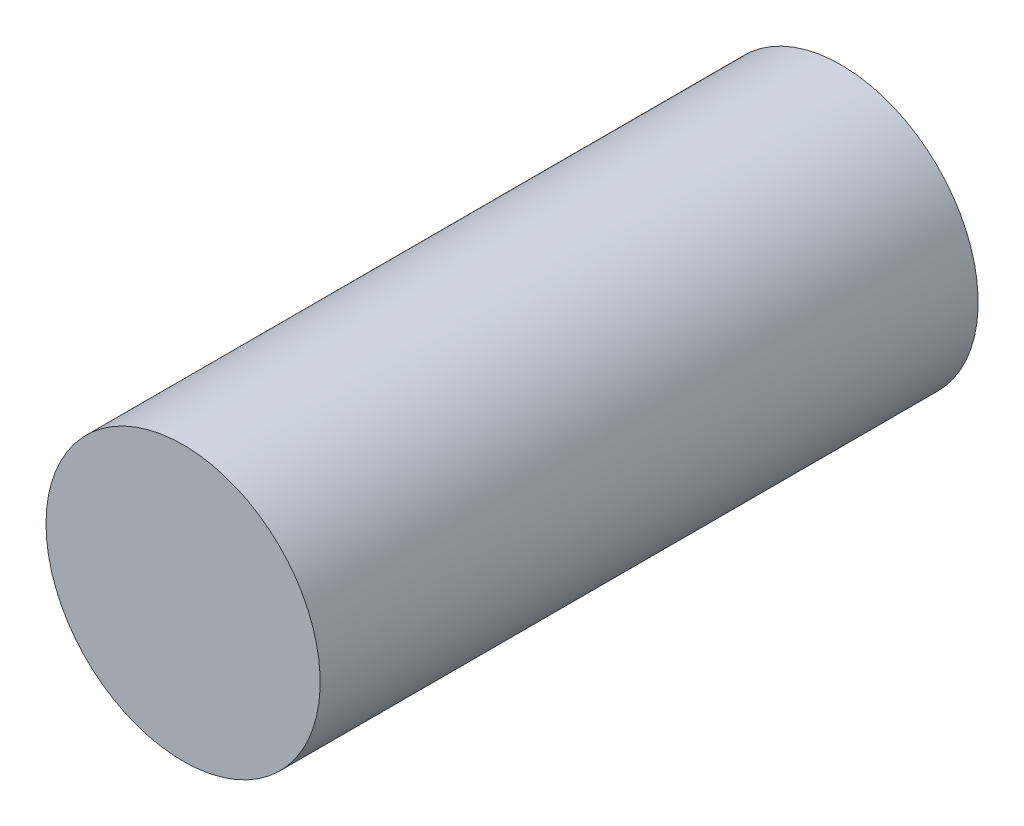
ISO-10303-21;
HEADER;
FILE_DESCRIPTION(('STEP AP214'),'2;1');
FILE_NAME('part.step','',(''),(''),'','','');
FILE_SCHEMA(('AUTOMOTIVE_DESIGN { 1 0 10303 214 1 1 1 1 }'));
ENDSEC;
DATA;
#1=APPLICATION_CONTEXT('core data for automotive mechanical design processes');
#2=APPLICATION_PROTOCOL_DEFINITION('international standard','automotive_design',2000,#1);
#3=PRODUCT_CONTEXT('',#1,'mechanical');
#4=PRODUCT('Part','Part','',(#3));
#5=PRODUCT_RELATED_PRODUCT_CATEGORY('part','',(#4));
#6=PRODUCT_DEFINITION_FORMATION('','',#4);
#7=PRODUCT_DEFINITION_CONTEXT('part definition',#1,'design');
#8=PRODUCT_DEFINITION('design','',#6,#7);
#9=PRODUCT_DEFINITION_SHAPE('','',#8);
#10=(LENGTH_UNIT() NAMED_UNIT(*) SI_UNIT(.MILLI.,.METRE.));
#11=(NAMED_UNIT(*) PLANE_ANGLE_UNIT() SI_UNIT($,.RADIAN.));
#12=(NAMED_UNIT(*) SI_UNIT($,.STERADIAN.) SOLID_ANGLE_UNIT());
#13=UNCERTAINTY_MEASURE_WITH_UNIT(LENGTH_MEASURE(1.E-05),#10,'distance_accuracy_value','');
#14=(GEOMETRIC_REPRESENTATION_CONTEXT(3) GLOBAL_UNCERTAINTY_ASSIGNED_CONTEXT((#13)) GLOBAL_UNIT_ASSIGNED_CONTEXT((#10,
#11,#12)) REPRESENTATION_CONTEXT('',''));
#15=CARTESIAN_POINT('',(0.,0.,0.));
#16=DIRECTION('',(0.,0.,1.));
#17=DIRECTION('',(1.,0.,0.));
#18=AXIS2_PLACEMENT_3D('',#15,#16,#17);
#19=CARTESIAN_POINT('',(0.,0.,38.1));
#20=DIRECTION('',(0.,0.,-1.));
#21=DIRECTION('',(-1.,0.,0.));
#22=AXIS2_PLACEMENT_3D('',#19,#20,#21);
#23=CYLINDRICAL_SURFACE('',#22,7.9375);
#24=CARTESIAN_POINT('',(0.,0.,38.1));
#25=DIRECTION('',(0.,0.,1.));
#26=DIRECTION('',(1.,0.,0.));
#27=AXIS2_PLACEMENT_3D('',#24,#25,#26);
#28=CIRCLE('',#27,7.9375);
#29=CARTESIAN_POINT('',(-7.9375,0.,38.1));
#30=VERTEX_POINT('',#29);
#31=EDGE_CURVE('E10',#30,#30,#28,.T.);
#32=CARTESIAN_POINT('',(0.,0.,0.));
#33=DIRECTION('',(0.,0.,1.));
#34=DIRECTION('',(1.,0.,0.));
#35=AXIS2_PLACEMENT_3D('',#32,#33,#34);
#36=CIRCLE('',#35,7.9375);
#37=CARTESIAN_POINT('',(-7.9375,0.,0.));
#38=VERTEX_POINT('',#37);
#39=EDGE_CURVE('E42',#38,#38,#36,.T.);
#40=CARTESIAN_POINT('',(-7.9375,0.,38.1));
#41=CARTESIAN_POINT('',(-7.9375,0.,37.703125));
#42=CARTESIAN_POINT('',(-7.9375,0.,37.30625));
#43=CARTESIAN_POINT('',(-7.9375,0.,36.5125));
#44=CARTESIAN_POINT('',(-7.9375,0.,36.115625));
#45=CARTESIAN_POINT('',(-7.9375,0.,35.321875));
#46=CARTESIAN_POINT('',(-7.9375,0.,34.925));
#47=CARTESIAN_POINT('',(-7.9375,0.,34.13125));
#48=CARTESIAN_POINT('',(-7.9375,0.,33.734375));
#49=CARTESIAN_POINT('',(-7.9375,0.,32.940625));
#50=CARTESIAN_POINT('',(-7.9375,0.,32.54375));
#51=CARTESIAN_POINT('',(-7.9375,0.,31.75));
#52=CARTESIAN_POINT('',(-7.9375,0.,31.353125));
#53=CARTESIAN_POINT('',(-7.9375,0.,30.559375));
#54=CARTESIAN_POINT('',(-7.9375,0.,30.1625));
#55=CARTESIAN_POINT('',(-7.9375,0.,29.36875));
#56=CARTESIAN_POINT('',(-7.9375,0.,28.971875));
#57=CARTESIAN_POINT('',(-7.9375,0.,28.178125));
#58=CARTESIAN_POINT('',(-7.9375,0.,27.78125));
#59=CARTESIAN_POINT('',(-7.9375,0.,26.9875));
#60=CARTESIAN_POINT('',(-7.9375,0.,26.590625));
#61=CARTESIAN_POINT('',(-7.9375,0.,25.796875));
#62=CARTESIAN_POINT('',(-7.9375,0.,25.4));
#63=CARTESIAN_POINT('',(-7.9375,0.,24.60625));
#64=CARTESIAN_POINT('',(-7.9375,0.,24.209375));
#65=CARTESIAN_POINT('',(-7.9375,0.,23.415625));
#66=CARTESIAN_POINT('',(-7.9375,0.,23.01875));
#67=CARTESIAN_POINT('',(-7.9375,0.,22.225));
#68=CARTESIAN_POINT('',(-7.9375,0.,21.828125));
#69=CARTESIAN_POINT('',(-7.9375,0.,21.034375));
#70=CARTESIAN_POINT('',(-7.9375,0.,20.6375));
#71=CARTESIAN_POINT('',(-7.9375,0.,19.84375));
#72=CARTESIAN_POINT('',(-7.9375,0.,19.446875));
#73=CARTESIAN_POINT('',(-7.9375,0.,18.653125));
#74=CARTESIAN_POINT('',(-7.9375,0.,18.25625));
#75=CARTESIAN_POINT('',(-7.9375,0.,17.4625));
#76=CARTESIAN_POINT('',(-7.9375,0.,17.065625));
#77=CARTESIAN_POINT('',(-7.9375,0.,16.271875));
#78=CARTESIAN_POINT('',(-7.9375,0.,15.875));
#79=CARTESIAN_POINT('',(-7.9375,0.,15.08125));
#80=CARTESIAN_POINT('',(-7.9375,0.,14.684375));
#81=CARTESIAN_POINT('',(-7.9375,0.,13.890625));
#82=CARTESIAN_POINT('',(-7.9375,0.,13.49375));
#83=CARTESIAN_POINT('',(-7.9375,0.,12.7));
#84=CARTESIAN_POINT('',(-7.9375,0.,12.303125));
#85=CARTESIAN_POINT('',(-7.9375,0.,11.509375));
#86=CARTESIAN_POINT('',(-7.9375,0.,11.1125));
#87=CARTESIAN_POINT('',(-7.9375,0.,10.31875));
#88=CARTESIAN_POINT('',(-7.9375,0.,9.92187499999999));
#89=CARTESIAN_POINT('',(-7.9375,0.,9.128125));
#90=CARTESIAN_POINT('',(-7.9375,0.,8.73124999999999));
#91=CARTESIAN_POINT('',(-7.9375,0.,7.93749999999999));
#92=CARTESIAN_POINT('',(-7.9375,0.,7.54062499999999));
#93=CARTESIAN_POINT('',(-7.9375,0.,6.746875));
#94=CARTESIAN_POINT('',(-7.9375,0.,6.35));
#95=CARTESIAN_POINT('',(-7.9375,0.,5.55625));
#96=CARTESIAN_POINT('',(-7.9375,0.,5.159375));
#97=CARTESIAN_POINT('',(-7.9375,0.,4.365625));
#98=CARTESIAN_POINT('',(-7.9375,0.,3.96875));
#99=CARTESIAN_POINT('',(-7.9375,0.,3.175));
#100=CARTESIAN_POINT('',(-7.9375,0.,2.778125));
#101=CARTESIAN_POINT('',(-7.9375,0.,1.984375));
#102=CARTESIAN_POINT('',(-7.9375,0.,1.5875));
#103=CARTESIAN_POINT('',(-7.9375,0.,0.79375));
#104=CARTESIAN_POINT('',(-7.9375,0.,0.396875));
#105=CARTESIAN_POINT('',(-7.9375,0.,0.));
#106=B_SPLINE_CURVE_WITH_KNOTS('',3,(#40,#41,#42,#43,#44,#45,#46,#47,#48,#49,#50,#51,#52,#53,
#54,#55,#56,#57,#58,#59,#60,#61,#62,#63,#64,#65,#66,#67,#68,#69,#70,#71,#72,#73,#74,#75,#76,#77,
#78,#79,#80,#81,#82,#83,#84,#85,#86,#87,#88,#89,#90,#91,#92,#93,#94,#95,#96,#97,#98,#99,#100,
#101,#102,#103,#104,#105),.UNSPECIFIED.,.F.,.F.,(4,2,2,2,2,2,2,2,2,2,2,2,2,2,2,2,2,2,2,2,2,2,2,
2,2,2,2,2,2,2,2,2,4),(0.,1.190625,2.38125,3.571875,4.7625,5.953125,7.14375,8.334375,
9.52500000000001,10.715625,11.90625,13.096875,14.2875,15.478125,16.66875,17.859375,19.05,
20.240625,21.43125,22.621875,23.8125,25.003125,26.19375,27.384375,28.575,29.765625,30.95625,
32.146875,33.3375,34.528125,35.71875,36.909375,38.1),.UNSPECIFIED.);
#107=EDGE_CURVE('BSEAM39',#30,#38,#106,.T.);
#108=ORIENTED_EDGE('',*,*,#31,.F.);
#109=ORIENTED_EDGE('',*,*,#39,.T.);
#110=ORIENTED_EDGE('',*,*,#107,.T.);
#111=ORIENTED_EDGE('',*,*,#107,.F.);
#112=EDGE_LOOP('',(#108,#110,#109,#111));
#113=FACE_BOUND('',#112,.T.);
#114=ADVANCED_FACE('F39',(#113),#23,.T.);
#115=CARTESIAN_POINT('',(0.,0.,38.1));
#116=DIRECTION('',(0.,0.,1.));
#117=DIRECTION('',(1.,0.,0.));
#118=AXIS2_PLACEMENT_3D('',#115,#116,#117);
#119=PLANE('',#118);
#120=ORIENTED_EDGE('',*,*,#31,.T.);
#121=EDGE_LOOP('',(#120));
#122=FACE_BOUND('',#121,.T.);
#123=ADVANCED_FACE('F56',(#122),#119,.T.);
#124=CARTESIAN_POINT('',(0.,0.,0.));
#125=DIRECTION('',(0.,0.,1.));
#126=DIRECTION('',(1.,0.,0.));
#127=AXIS2_PLACEMENT_3D('',#124,#125,#126);
#128=PLANE('',#127);
#129=ORIENTED_EDGE('',*,*,#39,.F.);
#130=EDGE_LOOP('',(#129));
#131=FACE_BOUND('',#130,.T.);
#132=ADVANCED_FACE('F54',(#131),#128,.F.);
#133=CLOSED_SHELL('',(#114,#123,#132));
#134=MANIFOLD_SOLID_BREP('B2',#133);
#135=ADVANCED_BREP_SHAPE_REPRESENTATION('',(#18,#134),#14);
#136=SHAPE_DEFINITION_REPRESENTATION(#9,#135);
ENDSEC;
END-ISO-10303-21;
